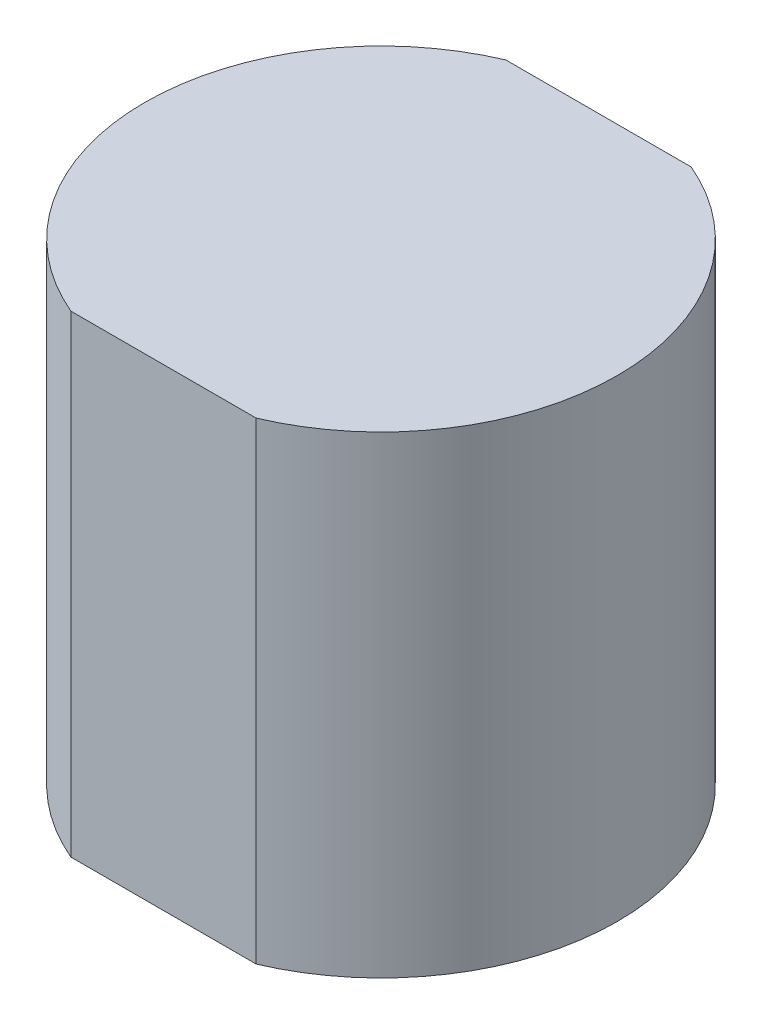
ISO-10303-21;
HEADER;
FILE_DESCRIPTION(('STEP AP214'),'2;1');
FILE_NAME('part.step','',(''),(''),'','','');
FILE_SCHEMA(('AUTOMOTIVE_DESIGN { 1 0 10303 214 1 1 1 1 }'));
ENDSEC;
DATA;
#1=APPLICATION_CONTEXT('core data for automotive mechanical design processes');
#2=APPLICATION_PROTOCOL_DEFINITION('international standard','automotive_design',2000,#1);
#3=PRODUCT_CONTEXT('',#1,'mechanical');
#4=PRODUCT('Part','Part','',(#3));
#5=PRODUCT_RELATED_PRODUCT_CATEGORY('part','',(#4));
#6=PRODUCT_DEFINITION_FORMATION('','',#4);
#7=PRODUCT_DEFINITION_CONTEXT('part definition',#1,'design');
#8=PRODUCT_DEFINITION('design','',#6,#7);
#9=PRODUCT_DEFINITION_SHAPE('','',#8);
#10=(LENGTH_UNIT() NAMED_UNIT(*) SI_UNIT(.MILLI.,.METRE.));
#11=(NAMED_UNIT(*) PLANE_ANGLE_UNIT() SI_UNIT($,.RADIAN.));
#12=(NAMED_UNIT(*) SI_UNIT($,.STERADIAN.) SOLID_ANGLE_UNIT());
#13=UNCERTAINTY_MEASURE_WITH_UNIT(LENGTH_MEASURE(1.E-05),#10,'distance_accuracy_value','');
#14=(GEOMETRIC_REPRESENTATION_CONTEXT(3) GLOBAL_UNCERTAINTY_ASSIGNED_CONTEXT((#13)) GLOBAL_UNIT_ASSIGNED_CONTEXT((#10,
#11,#12)) REPRESENTATION_CONTEXT('',''));
#15=CARTESIAN_POINT('',(0.,0.,0.));
#16=DIRECTION('',(0.,0.,1.));
#17=DIRECTION('',(1.,0.,0.));
#18=AXIS2_PLACEMENT_3D('',#15,#16,#17);
#19=CARTESIAN_POINT('',(0.,500.,0.));
#20=DIRECTION('',(0.,-1.,0.));
#21=DIRECTION('',(0.,0.,-1.));
#22=AXIS2_PLACEMENT_3D('',#19,#20,#21);
#23=CYLINDRICAL_SURFACE('',#22,250.);
#24=DIRECTION('',(0.,-1.,0.));
#25=VECTOR('',#24,1.);
#26=CARTESIAN_POINT('',(-97.9795897113271,500.,230.));
#27=LINE('',#26,#25);
#28=CARTESIAN_POINT('',(-97.9795897113271,500.,230.));
#29=VERTEX_POINT('',#28);
#30=CARTESIAN_POINT('',(-97.9795897113271,0.,230.));
#31=VERTEX_POINT('',#30);
#32=EDGE_CURVE('E49',#29,#31,#27,.T.);
#33=ORIENTED_EDGE('',*,*,#32,.F.);
#34=CARTESIAN_POINT('',(0.,500.,0.));
#35=DIRECTION('',(0.,1.,0.));
#36=DIRECTION('',(0.,0.,1.));
#37=AXIS2_PLACEMENT_3D('',#34,#35,#36);
#38=CIRCLE('',#37,250.);
#39=CARTESIAN_POINT('',(-97.9795897113271,500.,-230.));
#40=VERTEX_POINT('',#39);
#41=EDGE_CURVE('E86',#40,#29,#38,.T.);
#42=ORIENTED_EDGE('',*,*,#41,.F.);
#43=DIRECTION('',(0.,-1.,0.));
#44=VECTOR('',#43,1.);
#45=CARTESIAN_POINT('',(-97.9795897113271,500.,-230.));
#46=LINE('',#45,#44);
#47=CARTESIAN_POINT('',(-97.9795897113271,0.,-230.));
#48=VERTEX_POINT('',#47);
#49=EDGE_CURVE('E74',#48,#40,#46,.F.);
#50=ORIENTED_EDGE('',*,*,#49,.F.);
#51=CARTESIAN_POINT('',(0.,0.,0.));
#52=DIRECTION('',(0.,1.,0.));
#53=DIRECTION('',(0.,0.,1.));
#54=AXIS2_PLACEMENT_3D('',#51,#52,#53);
#55=CIRCLE('',#54,250.);
#56=EDGE_CURVE('E84',#48,#31,#55,.T.);
#57=ORIENTED_EDGE('',*,*,#56,.T.);
#58=EDGE_LOOP('',(#33,#42,#50,#57));
#59=FACE_BOUND('',#58,.T.);
#60=ADVANCED_FACE('F36',(#59),#23,.T.);
#61=DIRECTION('',(0.,-1.,0.));
#62=VECTOR('',#61,1.);
#63=CARTESIAN_POINT('',(97.9795897113271,500.,230.));
#64=LINE('',#63,#62);
#65=CARTESIAN_POINT('',(97.9795897113271,0.,230.));
#66=VERTEX_POINT('',#65);
#67=CARTESIAN_POINT('',(97.9795897113271,500.,230.));
#68=VERTEX_POINT('',#67);
#69=EDGE_CURVE('E92',#66,#68,#64,.F.);
#70=ORIENTED_EDGE('',*,*,#69,.F.);
#71=CARTESIAN_POINT('',(97.9795897113271,0.,-230.));
#72=VERTEX_POINT('',#71);
#73=EDGE_CURVE('E90',#66,#72,#55,.T.);
#74=ORIENTED_EDGE('',*,*,#73,.T.);
#75=DIRECTION('',(0.,-1.,0.));
#76=VECTOR('',#75,1.);
#77=CARTESIAN_POINT('',(97.9795897113271,500.,-230.));
#78=LINE('',#77,#76);
#79=CARTESIAN_POINT('',(97.9795897113271,500.,-230.));
#80=VERTEX_POINT('',#79);
#81=EDGE_CURVE('E57',#80,#72,#78,.T.);
#82=ORIENTED_EDGE('',*,*,#81,.F.);
#83=EDGE_CURVE('E80',#68,#80,#38,.T.);
#84=ORIENTED_EDGE('',*,*,#83,.F.);
#85=EDGE_LOOP('',(#70,#74,#82,#84));
#86=FACE_BOUND('',#85,.T.);
#87=ADVANCED_FACE('F107',(#86),#23,.T.);
#88=CARTESIAN_POINT('',(0.,500.,0.));
#89=DIRECTION('',(0.,1.,0.));
#90=DIRECTION('',(0.,0.,1.));
#91=AXIS2_PLACEMENT_3D('',#88,#89,#90);
#92=PLANE('',#91);
#93=ORIENTED_EDGE('',*,*,#41,.T.);
#94=DIRECTION('',(1.,0.,0.));
#95=VECTOR('',#94,1.);
#96=CARTESIAN_POINT('',(0.,500.,230.));
#97=LINE('',#96,#95);
#98=EDGE_CURVE('E98',#29,#68,#97,.T.);
#99=ORIENTED_EDGE('',*,*,#98,.T.);
#100=ORIENTED_EDGE('',*,*,#83,.T.);
#101=DIRECTION('',(-1.,0.,0.));
#102=VECTOR('',#101,1.);
#103=CARTESIAN_POINT('',(0.,500.,-230.));
#104=LINE('',#103,#102);
#105=EDGE_CURVE('E87',#80,#40,#104,.T.);
#106=ORIENTED_EDGE('',*,*,#105,.T.);
#107=EDGE_LOOP('',(#93,#99,#100,#106));
#108=FACE_BOUND('',#107,.T.);
#109=ADVANCED_FACE('F103',(#108),#92,.T.);
#110=CARTESIAN_POINT('',(0.,0.,0.));
#111=DIRECTION('',(0.,1.,0.));
#112=DIRECTION('',(0.,0.,1.));
#113=AXIS2_PLACEMENT_3D('',#110,#111,#112);
#114=PLANE('',#113);
#115=DIRECTION('',(1.,0.,0.));
#116=VECTOR('',#115,1.);
#117=CARTESIAN_POINT('',(0.,0.,230.));
#118=LINE('',#117,#116);
#119=EDGE_CURVE('E12',#31,#66,#118,.T.);
#120=ORIENTED_EDGE('',*,*,#119,.F.);
#121=ORIENTED_EDGE('',*,*,#56,.F.);
#122=DIRECTION('',(-1.,0.,0.));
#123=VECTOR('',#122,1.);
#124=CARTESIAN_POINT('',(0.,0.,-230.));
#125=LINE('',#124,#123);
#126=EDGE_CURVE('E43',#72,#48,#125,.T.);
#127=ORIENTED_EDGE('',*,*,#126,.F.);
#128=ORIENTED_EDGE('',*,*,#73,.F.);
#129=EDGE_LOOP('',(#120,#121,#127,#128));
#130=FACE_BOUND('',#129,.T.);
#131=ADVANCED_FACE('F89',(#130),#114,.F.);
#132=CARTESIAN_POINT('',(273.253187613843,599.,-230.));
#133=DIRECTION('',(0.,0.,-1.));
#134=DIRECTION('',(-1.,0.,0.));
#135=AXIS2_PLACEMENT_3D('',#132,#133,#134);
#136=PLANE('',#135);
#137=ORIENTED_EDGE('',*,*,#81,.T.);
#138=ORIENTED_EDGE('',*,*,#126,.T.);
#139=ORIENTED_EDGE('',*,*,#49,.T.);
#140=ORIENTED_EDGE('',*,*,#105,.F.);
#141=EDGE_LOOP('',(#137,#138,#139,#140));
#142=FACE_BOUND('',#141,.T.);
#143=ADVANCED_FACE('F73',(#142),#136,.T.);
#144=CARTESIAN_POINT('',(273.253187613843,599.,230.));
#145=DIRECTION('',(0.,0.,1.));
#146=DIRECTION('',(1.,0.,0.));
#147=AXIS2_PLACEMENT_3D('',#144,#145,#146);
#148=PLANE('',#147);
#149=ORIENTED_EDGE('',*,*,#32,.T.);
#150=ORIENTED_EDGE('',*,*,#119,.T.);
#151=ORIENTED_EDGE('',*,*,#69,.T.);
#152=ORIENTED_EDGE('',*,*,#98,.F.);
#153=EDGE_LOOP('',(#149,#150,#151,#152));
#154=FACE_BOUND('',#153,.T.);
#155=ADVANCED_FACE('F108',(#154),#148,.T.);
#156=CLOSED_SHELL('',(#60,#87,#109,#131,#143,#155));
#157=MANIFOLD_SOLID_BREP('B2',#156);
#158=ADVANCED_BREP_SHAPE_REPRESENTATION('',(#18,#157),#14);
#159=SHAPE_DEFINITION_REPRESENTATION(#9,#158);
ENDSEC;
END-ISO-10303-21;
